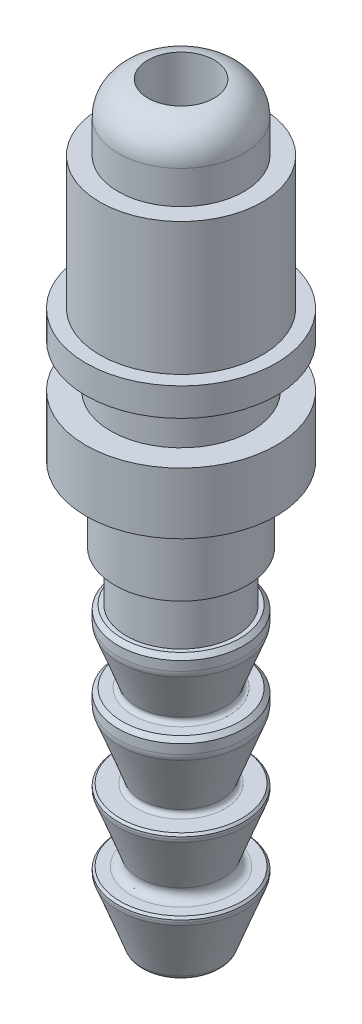
ISO-10303-21;
HEADER;
FILE_DESCRIPTION(('STEP AP214'),'2;1');
FILE_NAME('part.step','',(''),(''),'','','');
FILE_SCHEMA(('AUTOMOTIVE_DESIGN { 1 0 10303 214 1 1 1 1 }'));
ENDSEC;
DATA;
#1=APPLICATION_CONTEXT('core data for automotive mechanical design processes');
#2=APPLICATION_PROTOCOL_DEFINITION('international standard','automotive_design',2000,#1);
#3=PRODUCT_CONTEXT('',#1,'mechanical');
#4=PRODUCT('Part','Part','',(#3));
#5=PRODUCT_RELATED_PRODUCT_CATEGORY('part','',(#4));
#6=PRODUCT_DEFINITION_FORMATION('','',#4);
#7=PRODUCT_DEFINITION_CONTEXT('part definition',#1,'design');
#8=PRODUCT_DEFINITION('design','',#6,#7);
#9=PRODUCT_DEFINITION_SHAPE('','',#8);
#10=(LENGTH_UNIT() NAMED_UNIT(*) SI_UNIT(.MILLI.,.METRE.));
#11=(NAMED_UNIT(*) PLANE_ANGLE_UNIT() SI_UNIT($,.RADIAN.));
#12=(NAMED_UNIT(*) SI_UNIT($,.STERADIAN.) SOLID_ANGLE_UNIT());
#13=UNCERTAINTY_MEASURE_WITH_UNIT(LENGTH_MEASURE(1.E-05),#10,'distance_accuracy_value','');
#14=(GEOMETRIC_REPRESENTATION_CONTEXT(3) GLOBAL_UNCERTAINTY_ASSIGNED_CONTEXT((#13)) GLOBAL_UNIT_ASSIGNED_CONTEXT((#10,
#11,#12)) REPRESENTATION_CONTEXT('',''));
#15=CARTESIAN_POINT('',(0.,0.,0.));
#16=DIRECTION('',(0.,0.,1.));
#17=DIRECTION('',(1.,0.,0.));
#18=AXIS2_PLACEMENT_3D('',#15,#16,#17);
#19=CARTESIAN_POINT('',(0.,-12.4999999999999,0.));
#20=DIRECTION('',(0.,1.,0.));
#21=DIRECTION('',(0.,0.,1.));
#22=AXIS2_PLACEMENT_3D('',#19,#20,#21);
#23=CONICAL_SURFACE('',#22,2.3,0.358770670270573);
#24=CARTESIAN_POINT('',(0.,-11.5122191396029,0.));
#25=DIRECTION('',(0.,1.,0.));
#26=DIRECTION('',(0.,0.,1.));
#27=AXIS2_PLACEMENT_3D('',#24,#25,#26);
#28=CIRCLE('',#27,2.67041782264891);
#29=CARTESIAN_POINT('',(0.,-11.5122191396029,2.67041782264892));
#30=VERTEX_POINT('',#29);
#31=EDGE_CURVE('E62',#30,#30,#28,.T.);
#32=ORIENTED_EDGE('',*,*,#31,.T.);
#33=EDGE_LOOP('',(#32));
#34=FACE_BOUND('',#33,.T.);
#35=CARTESIAN_POINT('',(0.,-8.66978885981584,0.));
#36=DIRECTION('',(0.,-1.,0.));
#37=DIRECTION('',(0.,0.,-1.));
#38=AXIS2_PLACEMENT_3D('',#35,#36,#37);
#39=CIRCLE('',#38,3.73632917756904);
#40=CARTESIAN_POINT('',(0.,-8.66978885981584,-3.73632917756906));
#41=VERTEX_POINT('',#40);
#42=EDGE_CURVE('E74',#41,#41,#39,.T.);
#43=ORIENTED_EDGE('',*,*,#42,.T.);
#44=EDGE_LOOP('',(#43));
#45=FACE_BOUND('',#44,.T.);
#46=ADVANCED_FACE('F45',(#34,#45),#23,.T.);
#47=CARTESIAN_POINT('',(0.,16.,0.));
#48=DIRECTION('',(0.,-1.,0.));
#49=DIRECTION('',(0.,0.,-1.));
#50=AXIS2_PLACEMENT_3D('',#47,#48,#49);
#51=CYLINDRICAL_SURFACE('',#50,5.75);
#52=CARTESIAN_POINT('',(0.,3.69999999999999,0.));
#53=DIRECTION('',(0.,1.,0.));
#54=DIRECTION('',(0.,0.,1.));
#55=AXIS2_PLACEMENT_3D('',#52,#53,#54);
#56=CIRCLE('',#55,5.75);
#57=CARTESIAN_POINT('',(0.,3.69999999999999,5.75000000000002));
#58=VERTEX_POINT('',#57);
#59=EDGE_CURVE('E161',#58,#58,#56,.T.);
#60=ORIENTED_EDGE('',*,*,#59,.F.);
#61=EDGE_LOOP('',(#60));
#62=FACE_BOUND('',#61,.T.);
#63=CARTESIAN_POINT('',(0.,0.,0.));
#64=DIRECTION('',(0.,1.,0.));
#65=DIRECTION('',(0.,0.,1.));
#66=AXIS2_PLACEMENT_3D('',#63,#64,#65);
#67=CIRCLE('',#66,5.75);
#68=CARTESIAN_POINT('',(0.,0.,5.75000000000002));
#69=VERTEX_POINT('',#68);
#70=EDGE_CURVE('E131',#69,#69,#67,.T.);
#71=ORIENTED_EDGE('',*,*,#70,.T.);
#72=EDGE_LOOP('',(#71));
#73=FACE_BOUND('',#72,.T.);
#74=ADVANCED_FACE('F204',(#62,#73),#51,.T.);
#75=CARTESIAN_POINT('',(0.,0.,0.));
#76=DIRECTION('',(0.,1.,0.));
#77=DIRECTION('',(0.,0.,1.));
#78=AXIS2_PLACEMENT_3D('',#75,#76,#77);
#79=PLANE('',#78);
#80=CARTESIAN_POINT('',(0.,0.,0.));
#81=DIRECTION('',(0.,-1.,0.));
#82=DIRECTION('',(0.,0.,-1.));
#83=AXIS2_PLACEMENT_3D('',#80,#81,#82);
#84=CIRCLE('',#83,4.);
#85=CARTESIAN_POINT('',(0.,0.,-4.00000000000002));
#86=VERTEX_POINT('',#85);
#87=EDGE_CURVE('E126',#86,#86,#84,.T.);
#88=ORIENTED_EDGE('',*,*,#87,.F.);
#89=EDGE_LOOP('',(#88));
#90=FACE_BOUND('',#89,.T.);
#91=ORIENTED_EDGE('',*,*,#70,.F.);
#92=EDGE_LOOP('',(#91));
#93=FACE_BOUND('',#92,.T.);
#94=ADVANCED_FACE('F210',(#90,#93),#79,.F.);
#95=CARTESIAN_POINT('',(0.,-4.49999999999997,0.));
#96=DIRECTION('',(0.,1.,0.));
#97=DIRECTION('',(0.,0.,1.));
#98=AXIS2_PLACEMENT_3D('',#95,#96,#97);
#99=CYLINDRICAL_SURFACE('',#98,4.);
#100=CARTESIAN_POINT('',(0.,-4.49999999999997,0.));
#101=DIRECTION('',(0.,-1.,0.));
#102=DIRECTION('',(0.,0.,-1.));
#103=AXIS2_PLACEMENT_3D('',#100,#101,#102);
#104=CIRCLE('',#103,4.);
#105=CARTESIAN_POINT('',(0.,-4.49999999999997,-4.00000000000002));
#106=VERTEX_POINT('',#105);
#107=EDGE_CURVE('E138',#106,#106,#104,.T.);
#108=ORIENTED_EDGE('',*,*,#107,.F.);
#109=EDGE_LOOP('',(#108));
#110=FACE_BOUND('',#109,.T.);
#111=ORIENTED_EDGE('',*,*,#87,.T.);
#112=EDGE_LOOP('',(#111));
#113=FACE_BOUND('',#112,.T.);
#114=ADVANCED_FACE('F233',(#110,#113),#99,.T.);
#115=CARTESIAN_POINT('',(0.,-4.49999999999997,0.));
#116=DIRECTION('',(0.,-1.,0.));
#117=DIRECTION('',(0.,0.,-1.));
#118=AXIS2_PLACEMENT_3D('',#115,#116,#117);
#119=PLANE('',#118);
#120=CARTESIAN_POINT('',(0.,-4.49999999999997,0.));
#121=DIRECTION('',(0.,-1.,0.));
#122=DIRECTION('',(0.,0.,-1.));
#123=AXIS2_PLACEMENT_3D('',#120,#121,#122);
#124=CIRCLE('',#123,3.3);
#125=CARTESIAN_POINT('',(0.,-4.49999999999997,-3.30000000000002));
#126=VERTEX_POINT('',#125);
#127=EDGE_CURVE('E122',#126,#126,#124,.T.);
#128=ORIENTED_EDGE('',*,*,#127,.F.);
#129=EDGE_LOOP('',(#128));
#130=FACE_BOUND('',#129,.T.);
#131=ORIENTED_EDGE('',*,*,#107,.T.);
#132=EDGE_LOOP('',(#131));
#133=FACE_BOUND('',#132,.T.);
#134=ADVANCED_FACE('F229',(#130,#133),#119,.T.);
#135=CARTESIAN_POINT('',(0.,-7.49999999999997,0.));
#136=DIRECTION('',(0.,1.,0.));
#137=DIRECTION('',(0.,0.,1.));
#138=AXIS2_PLACEMENT_3D('',#135,#136,#137);
#139=CYLINDRICAL_SURFACE('',#138,3.3);
#140=CARTESIAN_POINT('',(0.,-7.49999999999997,0.));
#141=DIRECTION('',(0.,-1.,0.));
#142=DIRECTION('',(0.,0.,-1.));
#143=AXIS2_PLACEMENT_3D('',#140,#141,#142);
#144=CIRCLE('',#143,3.3);
#145=CARTESIAN_POINT('',(0.,-7.49999999999997,-3.30000000000002));
#146=VERTEX_POINT('',#145);
#147=EDGE_CURVE('E147',#146,#146,#144,.T.);
#148=ORIENTED_EDGE('',*,*,#147,.F.);
#149=EDGE_LOOP('',(#148));
#150=FACE_BOUND('',#149,.T.);
#151=ORIENTED_EDGE('',*,*,#127,.T.);
#152=EDGE_LOOP('',(#151));
#153=FACE_BOUND('',#152,.T.);
#154=ADVANCED_FACE('F225',(#150,#153),#139,.T.);
#155=CARTESIAN_POINT('',(0.,-8.49999999999997,0.));
#156=DIRECTION('',(0.,1.,0.));
#157=DIRECTION('',(0.,0.,1.));
#158=AXIS2_PLACEMENT_3D('',#155,#156,#157);
#159=CYLINDRICAL_SURFACE('',#158,3.8);
#160=CARTESIAN_POINT('',(0.,-8.31866541822745,0.));
#161=DIRECTION('',(0.,-1.,0.));
#162=DIRECTION('',(0.,0.,-1.));
#163=AXIS2_PLACEMENT_3D('',#160,#161,#162);
#164=CIRCLE('',#163,3.8);
#165=CARTESIAN_POINT('',(0.,-8.31866541822745,-3.80000000000002));
#166=VERTEX_POINT('',#165);
#167=EDGE_CURVE('E77',#166,#166,#164,.F.);
#168=ORIENTED_EDGE('',*,*,#167,.T.);
#169=EDGE_LOOP('',(#168));
#170=FACE_BOUND('',#169,.T.);
#171=CARTESIAN_POINT('',(0.,-7.74999999999994,0.));
#172=DIRECTION('',(0.,-1.,0.));
#173=DIRECTION('',(0.,0.,-1.));
#174=AXIS2_PLACEMENT_3D('',#171,#172,#173);
#175=CIRCLE('',#174,3.8);
#176=CARTESIAN_POINT('',(0.,-7.74999999999994,-3.80000000000002));
#177=VERTEX_POINT('',#176);
#178=EDGE_CURVE('E119',#177,#177,#175,.T.);
#179=ORIENTED_EDGE('',*,*,#178,.T.);
#180=EDGE_LOOP('',(#179));
#181=FACE_BOUND('',#180,.T.);
#182=ADVANCED_FACE('F221',(#170,#181),#159,.T.);
#183=CARTESIAN_POINT('',(0.,-7.49999999999997,0.));
#184=DIRECTION('',(0.,-1.,0.));
#185=DIRECTION('',(0.,0.,-1.));
#186=AXIS2_PLACEMENT_3D('',#183,#184,#185);
#187=PLANE('',#186);
#188=CARTESIAN_POINT('',(0.,-7.49999999999997,0.));
#189=DIRECTION('',(0.,-1.,0.));
#190=DIRECTION('',(0.,0.,-1.));
#191=AXIS2_PLACEMENT_3D('',#188,#189,#190);
#192=CIRCLE('',#191,3.55);
#193=CARTESIAN_POINT('',(0.,-7.49999999999997,-3.55000000000002));
#194=VERTEX_POINT('',#193);
#195=EDGE_CURVE('E116',#194,#194,#192,.F.);
#196=ORIENTED_EDGE('',*,*,#195,.T.);
#197=EDGE_LOOP('',(#196));
#198=FACE_BOUND('',#197,.T.);
#199=ORIENTED_EDGE('',*,*,#147,.T.);
#200=EDGE_LOOP('',(#199));
#201=FACE_BOUND('',#200,.T.);
#202=ADVANCED_FACE('F218',(#198,#201),#187,.F.);
#203=CARTESIAN_POINT('',(0.,-12.85,0.));
#204=DIRECTION('',(0.,1.,0.));
#205=DIRECTION('',(0.,0.,1.));
#206=AXIS2_PLACEMENT_3D('',#203,#204,#205);
#207=CYLINDRICAL_SURFACE('',#206,3.8);
#208=CARTESIAN_POINT('',(0.,-12.6686654182274,0.));
#209=DIRECTION('',(0.,-1.,0.));
#210=DIRECTION('',(0.,0.,-1.));
#211=AXIS2_PLACEMENT_3D('',#208,#209,#210);
#212=CIRCLE('',#211,3.8);
#213=CARTESIAN_POINT('',(0.,-12.6686654182274,-3.80000000000002));
#214=VERTEX_POINT('',#213);
#215=EDGE_CURVE('E83',#214,#214,#212,.F.);
#216=ORIENTED_EDGE('',*,*,#215,.T.);
#217=EDGE_LOOP('',(#216));
#218=FACE_BOUND('',#217,.T.);
#219=CARTESIAN_POINT('',(0.,-12.1,0.));
#220=DIRECTION('',(0.,-1.,0.));
#221=DIRECTION('',(0.,0.,-1.));
#222=AXIS2_PLACEMENT_3D('',#219,#220,#221);
#223=CIRCLE('',#222,3.8);
#224=CARTESIAN_POINT('',(0.,-12.1,-3.80000000000002));
#225=VERTEX_POINT('',#224);
#226=EDGE_CURVE('E113',#225,#225,#223,.T.);
#227=ORIENTED_EDGE('',*,*,#226,.T.);
#228=EDGE_LOOP('',(#227));
#229=FACE_BOUND('',#228,.T.);
#230=ADVANCED_FACE('F216',(#218,#229),#207,.T.);
#231=CARTESIAN_POINT('',(0.,-11.85,0.));
#232=DIRECTION('',(0.,-1.,0.));
#233=DIRECTION('',(0.,0.,-1.));
#234=AXIS2_PLACEMENT_3D('',#231,#232,#233);
#235=PLANE('',#234);
#236=CARTESIAN_POINT('',(0.,-11.85,0.));
#237=DIRECTION('',(0.,-1.,0.));
#238=DIRECTION('',(0.,0.,-1.));
#239=AXIS2_PLACEMENT_3D('',#236,#237,#238);
#240=CIRCLE('',#239,2.90450011704117);
#241=CARTESIAN_POINT('',(0.,-11.85,-2.90450011704118));
#242=VERTEX_POINT('',#241);
#243=EDGE_CURVE('E65',#242,#242,#240,.T.);
#244=ORIENTED_EDGE('',*,*,#243,.T.);
#245=EDGE_LOOP('',(#244));
#246=FACE_BOUND('',#245,.T.);
#247=CARTESIAN_POINT('',(0.,-11.85,0.));
#248=DIRECTION('',(0.,-1.,0.));
#249=DIRECTION('',(0.,0.,-1.));
#250=AXIS2_PLACEMENT_3D('',#247,#248,#249);
#251=CIRCLE('',#250,3.55);
#252=CARTESIAN_POINT('',(0.,-11.85,-3.55000000000002));
#253=VERTEX_POINT('',#252);
#254=EDGE_CURVE('E110',#253,#253,#251,.F.);
#255=ORIENTED_EDGE('',*,*,#254,.T.);
#256=EDGE_LOOP('',(#255));
#257=FACE_BOUND('',#256,.T.);
#258=ADVANCED_FACE('F324',(#246,#257),#235,.F.);
#259=CARTESIAN_POINT('',(-3.8,-16.85,0.));
#260=DIRECTION('',(0.,-1.,0.));
#261=DIRECTION('',(0.,0.,-1.));
#262=AXIS2_PLACEMENT_3D('',#259,#260,#261);
#263=PLANE('',#262);
#264=CARTESIAN_POINT('',(0.,-16.85,0.));
#265=DIRECTION('',(0.,-1.,0.));
#266=DIRECTION('',(0.,0.,-1.));
#267=AXIS2_PLACEMENT_3D('',#264,#265,#266);
#268=CIRCLE('',#267,2.66075011704117);
#269=CARTESIAN_POINT('',(0.,-16.85,-2.66075011704118));
#270=VERTEX_POINT('',#269);
#271=EDGE_CURVE('E68',#270,#270,#268,.T.);
#272=ORIENTED_EDGE('',*,*,#271,.T.);
#273=EDGE_LOOP('',(#272));
#274=FACE_BOUND('',#273,.T.);
#275=CARTESIAN_POINT('',(0.,-16.85,0.));
#276=DIRECTION('',(0.,-1.,0.));
#277=DIRECTION('',(0.,0.,-1.));
#278=AXIS2_PLACEMENT_3D('',#275,#276,#277);
#279=CIRCLE('',#278,3.675);
#280=CARTESIAN_POINT('',(0.,-16.85,-3.67500000000002));
#281=VERTEX_POINT('',#280);
#282=EDGE_CURVE('E107',#281,#281,#279,.F.);
#283=ORIENTED_EDGE('',*,*,#282,.T.);
#284=EDGE_LOOP('',(#283));
#285=FACE_BOUND('',#284,.T.);
#286=ADVANCED_FACE('F322',(#274,#285),#263,.F.);
#287=CARTESIAN_POINT('',(0.,-16.85,0.));
#288=DIRECTION('',(0.,1.,0.));
#289=DIRECTION('',(0.,0.,1.));
#290=AXIS2_PLACEMENT_3D('',#287,#288,#289);
#291=CONICAL_SURFACE('',#290,2.3,0.358770670270573);
#292=CARTESIAN_POINT('',(0.,-16.5122191396029,0.));
#293=DIRECTION('',(0.,1.,0.));
#294=DIRECTION('',(0.,0.,1.));
#295=AXIS2_PLACEMENT_3D('',#292,#293,#294);
#296=CIRCLE('',#295,2.42666782264891);
#297=CARTESIAN_POINT('',(0.,-16.5122191396029,2.42666782264892));
#298=VERTEX_POINT('',#297);
#299=EDGE_CURVE('E71',#298,#298,#296,.T.);
#300=ORIENTED_EDGE('',*,*,#299,.T.);
#301=EDGE_LOOP('',(#300));
#302=FACE_BOUND('',#301,.T.);
#303=CARTESIAN_POINT('',(0.,-13.0197888598158,0.));
#304=DIRECTION('',(0.,-1.,0.));
#305=DIRECTION('',(0.,0.,-1.));
#306=AXIS2_PLACEMENT_3D('',#303,#304,#305);
#307=CIRCLE('',#306,3.73632917756904);
#308=CARTESIAN_POINT('',(0.,-13.0197888598158,-3.73632917756906));
#309=VERTEX_POINT('',#308);
#310=EDGE_CURVE('E80',#309,#309,#307,.T.);
#311=ORIENTED_EDGE('',*,*,#310,.T.);
#312=EDGE_LOOP('',(#311));
#313=FACE_BOUND('',#312,.T.);
#314=ADVANCED_FACE('F317',(#302,#313),#291,.T.);
#315=CARTESIAN_POINT('',(0.,-17.1093327091137,0.));
#316=DIRECTION('',(0.,-1.,0.));
#317=DIRECTION('',(0.,0.,-1.));
#318=AXIS2_PLACEMENT_3D('',#315,#316,#317);
#319=CIRCLE('',#318,3.8);
#320=CARTESIAN_POINT('',(0.,-17.1093327091137,-3.80000000000002));
#321=VERTEX_POINT('',#320);
#322=EDGE_CURVE('E95',#321,#321,#319,.F.);
#323=ORIENTED_EDGE('',*,*,#322,.T.);
#324=EDGE_LOOP('',(#323));
#325=FACE_BOUND('',#324,.T.);
#326=CARTESIAN_POINT('',(0.,-16.975,0.));
#327=DIRECTION('',(0.,-1.,0.));
#328=DIRECTION('',(0.,0.,-1.));
#329=AXIS2_PLACEMENT_3D('',#326,#327,#328);
#330=CIRCLE('',#329,3.8);
#331=CARTESIAN_POINT('',(0.,-16.975,-3.80000000000002));
#332=VERTEX_POINT('',#331);
#333=EDGE_CURVE('E104',#332,#332,#330,.T.);
#334=ORIENTED_EDGE('',*,*,#333,.T.);
#335=EDGE_LOOP('',(#334));
#336=FACE_BOUND('',#335,.T.);
#337=ADVANCED_FACE('F314',(#325,#336),#207,.T.);
#338=CARTESIAN_POINT('',(-3.8,-21.2,0.));
#339=DIRECTION('',(0.,-1.,0.));
#340=DIRECTION('',(0.,0.,-1.));
#341=AXIS2_PLACEMENT_3D('',#338,#339,#340);
#342=PLANE('',#341);
#343=CARTESIAN_POINT('',(0.,-21.2,0.));
#344=DIRECTION('',(0.,-1.,0.));
#345=DIRECTION('',(0.,0.,-1.));
#346=AXIS2_PLACEMENT_3D('',#343,#344,#345);
#347=CIRCLE('',#346,3.02150023408234);
#348=CARTESIAN_POINT('',(0.,-21.2,-3.02150023408236));
#349=VERTEX_POINT('',#348);
#350=EDGE_CURVE('E53',#349,#349,#347,.T.);
#351=ORIENTED_EDGE('',*,*,#350,.T.);
#352=EDGE_LOOP('',(#351));
#353=FACE_BOUND('',#352,.T.);
#354=CARTESIAN_POINT('',(0.,-21.2,0.));
#355=DIRECTION('',(0.,-1.,0.));
#356=DIRECTION('',(0.,0.,-1.));
#357=AXIS2_PLACEMENT_3D('',#354,#355,#356);
#358=CIRCLE('',#357,3.67499999999999);
#359=CARTESIAN_POINT('',(0.,-21.2,-3.67500000000001));
#360=VERTEX_POINT('',#359);
#361=EDGE_CURVE('E101',#360,#360,#358,.F.);
#362=ORIENTED_EDGE('',*,*,#361,.T.);
#363=EDGE_LOOP('',(#362));
#364=FACE_BOUND('',#363,.T.);
#365=ADVANCED_FACE('F308',(#353,#364),#342,.F.);
#366=CARTESIAN_POINT('',(0.,-21.2,0.));
#367=DIRECTION('',(0.,1.,0.));
#368=DIRECTION('',(0.,0.,1.));
#369=AXIS2_PLACEMENT_3D('',#366,#367,#368);
#370=CONICAL_SURFACE('',#369,2.3,0.358770670270573);
#371=CARTESIAN_POINT('',(0.,-20.5244382792058,0.));
#372=DIRECTION('',(0.,1.,0.));
#373=DIRECTION('',(0.,0.,1.));
#374=AXIS2_PLACEMENT_3D('',#371,#372,#373);
#375=CIRCLE('',#374,2.55333564529782);
#376=CARTESIAN_POINT('',(0.,-20.5244382792058,2.55333564529783));
#377=VERTEX_POINT('',#376);
#378=EDGE_CURVE('E57',#377,#377,#375,.T.);
#379=ORIENTED_EDGE('',*,*,#378,.T.);
#380=EDGE_LOOP('',(#379));
#381=FACE_BOUND('',#380,.T.);
#382=CARTESIAN_POINT('',(0.,-17.2848944299079,0.));
#383=DIRECTION('',(0.,-1.,0.));
#384=DIRECTION('',(0.,0.,-1.));
#385=AXIS2_PLACEMENT_3D('',#382,#383,#384);
#386=CIRCLE('',#385,3.76816458878452);
#387=CARTESIAN_POINT('',(0.,-17.2848944299079,-3.76816458878454));
#388=VERTEX_POINT('',#387);
#389=EDGE_CURVE('E92',#388,#388,#386,.T.);
#390=ORIENTED_EDGE('',*,*,#389,.T.);
#391=EDGE_LOOP('',(#390));
#392=FACE_BOUND('',#391,.T.);
#393=ADVANCED_FACE('F304',(#381,#392),#370,.T.);
#394=CARTESIAN_POINT('',(0.,-21.4593327091137,0.));
#395=DIRECTION('',(0.,-1.,0.));
#396=DIRECTION('',(0.,0.,-1.));
#397=AXIS2_PLACEMENT_3D('',#394,#395,#396);
#398=CIRCLE('',#397,3.8);
#399=CARTESIAN_POINT('',(0.,-21.4593327091137,-3.80000000000002));
#400=VERTEX_POINT('',#399);
#401=EDGE_CURVE('E89',#400,#400,#398,.F.);
#402=ORIENTED_EDGE('',*,*,#401,.T.);
#403=EDGE_LOOP('',(#402));
#404=FACE_BOUND('',#403,.T.);
#405=CARTESIAN_POINT('',(0.,-21.325,0.));
#406=DIRECTION('',(0.,-1.,0.));
#407=DIRECTION('',(0.,0.,-1.));
#408=AXIS2_PLACEMENT_3D('',#405,#406,#407);
#409=CIRCLE('',#408,3.8);
#410=CARTESIAN_POINT('',(0.,-21.325,-3.80000000000002));
#411=VERTEX_POINT('',#410);
#412=EDGE_CURVE('E98',#411,#411,#409,.T.);
#413=ORIENTED_EDGE('',*,*,#412,.T.);
#414=EDGE_LOOP('',(#413));
#415=FACE_BOUND('',#414,.T.);
#416=ADVANCED_FACE('F307',(#404,#415),#207,.T.);
#417=CARTESIAN_POINT('',(0.,-25.55,0.));
#418=DIRECTION('',(0.,1.,0.));
#419=DIRECTION('',(0.,0.,1.));
#420=AXIS2_PLACEMENT_3D('',#417,#418,#419);
#421=CONICAL_SURFACE('',#420,2.3,0.358770670270573);
#422=CARTESIAN_POINT('',(0.,-25.2255617207941,0.));
#423=DIRECTION('',(0.,1.,0.));
#424=DIRECTION('',(0.,0.,1.));
#425=AXIS2_PLACEMENT_3D('',#422,#423,#424);
#426=CIRCLE('',#425,2.42166435470217);
#427=CARTESIAN_POINT('',(0.,-25.2255617207941,2.42166435470219));
#428=VERTEX_POINT('',#427);
#429=EDGE_CURVE('E13',#428,#428,#426,.T.);
#430=ORIENTED_EDGE('',*,*,#429,.T.);
#431=EDGE_LOOP('',(#430));
#432=FACE_BOUND('',#431,.T.);
#433=CARTESIAN_POINT('',(0.,-21.6348944299079,0.));
#434=DIRECTION('',(0.,-1.,0.));
#435=DIRECTION('',(0.,0.,-1.));
#436=AXIS2_PLACEMENT_3D('',#433,#434,#435);
#437=CIRCLE('',#436,3.76816458878452);
#438=CARTESIAN_POINT('',(0.,-21.6348944299079,-3.76816458878454));
#439=VERTEX_POINT('',#438);
#440=EDGE_CURVE('E86',#439,#439,#437,.T.);
#441=ORIENTED_EDGE('',*,*,#440,.T.);
#442=EDGE_LOOP('',(#441));
#443=FACE_BOUND('',#442,.T.);
#444=ADVANCED_FACE('F256',(#432,#443),#421,.T.);
#445=CARTESIAN_POINT('',(0.,-7.74999999999994,0.));
#446=DIRECTION('',(0.,-1.,0.));
#447=DIRECTION('',(0.,0.,-1.));
#448=AXIS2_PLACEMENT_3D('',#445,#446,#447);
#449=CONICAL_SURFACE('',#448,3.8,0.785398163397448);
#450=ORIENTED_EDGE('',*,*,#195,.F.);
#451=EDGE_LOOP('',(#450));
#452=FACE_BOUND('',#451,.T.);
#453=ORIENTED_EDGE('',*,*,#178,.F.);
#454=EDGE_LOOP('',(#453));
#455=FACE_BOUND('',#454,.T.);
#456=ADVANCED_FACE('F252',(#452,#455),#449,.T.);
#457=CARTESIAN_POINT('',(0.,-12.1,0.));
#458=DIRECTION('',(0.,-1.,0.));
#459=DIRECTION('',(0.,0.,-1.));
#460=AXIS2_PLACEMENT_3D('',#457,#458,#459);
#461=CONICAL_SURFACE('',#460,3.8,0.785398163397453);
#462=ORIENTED_EDGE('',*,*,#254,.F.);
#463=EDGE_LOOP('',(#462));
#464=FACE_BOUND('',#463,.T.);
#465=ORIENTED_EDGE('',*,*,#226,.F.);
#466=EDGE_LOOP('',(#465));
#467=FACE_BOUND('',#466,.T.);
#468=ADVANCED_FACE('F255',(#464,#467),#461,.T.);
#469=CARTESIAN_POINT('',(0.,-16.85,0.));
#470=DIRECTION('',(0.,-1.,0.));
#471=DIRECTION('',(0.,0.,-1.));
#472=AXIS2_PLACEMENT_3D('',#469,#470,#471);
#473=CONICAL_SURFACE('',#472,3.675,0.785398163397415);
#474=ORIENTED_EDGE('',*,*,#333,.F.);
#475=EDGE_LOOP('',(#474));
#476=FACE_BOUND('',#475,.T.);
#477=ORIENTED_EDGE('',*,*,#282,.F.);
#478=EDGE_LOOP('',(#477));
#479=FACE_BOUND('',#478,.T.);
#480=ADVANCED_FACE('F260',(#476,#479),#473,.T.);
#481=CARTESIAN_POINT('',(0.,-21.2,0.));
#482=DIRECTION('',(0.,-1.,0.));
#483=DIRECTION('',(0.,0.,-1.));
#484=AXIS2_PLACEMENT_3D('',#481,#482,#483);
#485=CONICAL_SURFACE('',#484,3.67499999999999,0.785398163397415);
#486=ORIENTED_EDGE('',*,*,#412,.F.);
#487=EDGE_LOOP('',(#486));
#488=FACE_BOUND('',#487,.T.);
#489=ORIENTED_EDGE('',*,*,#361,.F.);
#490=EDGE_LOOP('',(#489));
#491=FACE_BOUND('',#490,.T.);
#492=ADVANCED_FACE('F264',(#488,#491),#485,.T.);
#493=CARTESIAN_POINT('',(0.,-17.1093327091137,0.));
#494=DIRECTION('',(0.,-1.,0.));
#495=DIRECTION('',(0.,0.,-1.));
#496=AXIS2_PLACEMENT_3D('',#493,#494,#495);
#497=TOROIDAL_SURFACE('',#496,3.3,0.5);
#498=ORIENTED_EDGE('',*,*,#389,.F.);
#499=EDGE_LOOP('',(#498));
#500=FACE_BOUND('',#499,.T.);
#501=ORIENTED_EDGE('',*,*,#322,.F.);
#502=EDGE_LOOP('',(#501));
#503=FACE_BOUND('',#502,.T.);
#504=ADVANCED_FACE('F268',(#500,#503),#497,.T.);
#505=CARTESIAN_POINT('',(0.,-21.4593327091137,0.));
#506=DIRECTION('',(0.,-1.,0.));
#507=DIRECTION('',(0.,0.,-1.));
#508=AXIS2_PLACEMENT_3D('',#505,#506,#507);
#509=TOROIDAL_SURFACE('',#508,3.3,0.5);
#510=ORIENTED_EDGE('',*,*,#440,.F.);
#511=EDGE_LOOP('',(#510));
#512=FACE_BOUND('',#511,.T.);
#513=ORIENTED_EDGE('',*,*,#401,.F.);
#514=EDGE_LOOP('',(#513));
#515=FACE_BOUND('',#514,.T.);
#516=ADVANCED_FACE('F272',(#512,#515),#509,.T.);
#517=CARTESIAN_POINT('',(0.,-12.6686654182274,0.));
#518=DIRECTION('',(0.,-1.,0.));
#519=DIRECTION('',(0.,0.,-1.));
#520=AXIS2_PLACEMENT_3D('',#517,#518,#519);
#521=TOROIDAL_SURFACE('',#520,2.8,1.);
#522=ORIENTED_EDGE('',*,*,#310,.F.);
#523=EDGE_LOOP('',(#522));
#524=FACE_BOUND('',#523,.T.);
#525=ORIENTED_EDGE('',*,*,#215,.F.);
#526=EDGE_LOOP('',(#525));
#527=FACE_BOUND('',#526,.T.);
#528=ADVANCED_FACE('F276',(#524,#527),#521,.T.);
#529=CARTESIAN_POINT('',(0.,-8.31866541822745,0.));
#530=DIRECTION('',(0.,-1.,0.));
#531=DIRECTION('',(0.,0.,-1.));
#532=AXIS2_PLACEMENT_3D('',#529,#530,#531);
#533=TOROIDAL_SURFACE('',#532,2.8,1.);
#534=ORIENTED_EDGE('',*,*,#42,.F.);
#535=EDGE_LOOP('',(#534));
#536=FACE_BOUND('',#535,.T.);
#537=ORIENTED_EDGE('',*,*,#167,.F.);
#538=EDGE_LOOP('',(#537));
#539=FACE_BOUND('',#538,.T.);
#540=ADVANCED_FACE('F280',(#536,#539),#533,.T.);
#541=CARTESIAN_POINT('',(0.,-16.6,0.));
#542=DIRECTION('',(0.,-1.,0.));
#543=DIRECTION('',(0.,0.,-1.));
#544=AXIS2_PLACEMENT_3D('',#541,#542,#543);
#545=TOROIDAL_SURFACE('',#544,2.66075011704117,0.25);
#546=ORIENTED_EDGE('',*,*,#271,.F.);
#547=EDGE_LOOP('',(#546));
#548=FACE_BOUND('',#547,.T.);
#549=ORIENTED_EDGE('',*,*,#299,.F.);
#550=EDGE_LOOP('',(#549));
#551=FACE_BOUND('',#550,.T.);
#552=ADVANCED_FACE('F284',(#548,#551),#545,.F.);
#553=CARTESIAN_POINT('',(0.,-11.6,0.));
#554=DIRECTION('',(0.,-1.,0.));
#555=DIRECTION('',(0.,0.,-1.));
#556=AXIS2_PLACEMENT_3D('',#553,#554,#555);
#557=TOROIDAL_SURFACE('',#556,2.90450011704117,0.25);
#558=ORIENTED_EDGE('',*,*,#31,.F.);
#559=EDGE_LOOP('',(#558));
#560=FACE_BOUND('',#559,.T.);
#561=ORIENTED_EDGE('',*,*,#243,.F.);
#562=EDGE_LOOP('',(#561));
#563=FACE_BOUND('',#562,.T.);
#564=ADVANCED_FACE('F288',(#560,#563),#557,.F.);
#565=CARTESIAN_POINT('',(0.,-20.7,0.));
#566=DIRECTION('',(0.,-1.,0.));
#567=DIRECTION('',(0.,0.,-1.));
#568=AXIS2_PLACEMENT_3D('',#565,#566,#567);
#569=TOROIDAL_SURFACE('',#568,3.02150023408234,0.5);
#570=ORIENTED_EDGE('',*,*,#350,.F.);
#571=EDGE_LOOP('',(#570));
#572=FACE_BOUND('',#571,.T.);
#573=ORIENTED_EDGE('',*,*,#378,.F.);
#574=EDGE_LOOP('',(#573));
#575=FACE_BOUND('',#574,.T.);
#576=ADVANCED_FACE('F291',(#572,#575),#569,.F.);
#577=CARTESIAN_POINT('',(0.,-25.05,0.));
#578=DIRECTION('',(0.,-1.,0.));
#579=DIRECTION('',(0.,0.,-1.));
#580=AXIS2_PLACEMENT_3D('',#577,#578,#579);
#581=TOROIDAL_SURFACE('',#580,1.95349976591765,0.5);
#582=CARTESIAN_POINT('',(0.,-25.547833032482,0.));
#583=DIRECTION('',(0.,1.,0.));
#584=DIRECTION('',(0.,0.,1.));
#585=AXIS2_PLACEMENT_3D('',#582,#583,#584);
#586=CIRCLE('',#585,2.);
#587=CARTESIAN_POINT('',(0.,-25.547833032482,-2.));
#588=VERTEX_POINT('',#587);
#589=EDGE_CURVE('E164',#588,#588,#586,.F.);
#590=ORIENTED_EDGE('',*,*,#589,.F.);
#591=EDGE_LOOP('',(#590));
#592=FACE_BOUND('',#591,.T.);
#593=ORIENTED_EDGE('',*,*,#429,.F.);
#594=EDGE_LOOP('',(#593));
#595=FACE_BOUND('',#594,.T.);
#596=ADVANCED_FACE('F47',(#592,#595),#581,.T.);
#597=CARTESIAN_POINT('',(0.,6.3,5.75000000000003));
#598=DIRECTION('',(0.,1.,0.));
#599=DIRECTION('',(0.,0.,1.));
#600=AXIS2_PLACEMENT_3D('',#597,#598,#599);
#601=PLANE('',#600);
#602=CARTESIAN_POINT('',(0.,6.3,0.));
#603=DIRECTION('',(0.,1.,0.));
#604=DIRECTION('',(0.,0.,1.));
#605=AXIS2_PLACEMENT_3D('',#602,#603,#604);
#606=CIRCLE('',#605,5.75);
#607=CARTESIAN_POINT('',(0.,6.3,5.75000000000002));
#608=VERTEX_POINT('',#607);
#609=EDGE_CURVE('E152',#608,#608,#606,.T.);
#610=ORIENTED_EDGE('',*,*,#609,.F.);
#611=EDGE_LOOP('',(#610));
#612=FACE_BOUND('',#611,.T.);
#613=CARTESIAN_POINT('',(0.,6.3,0.));
#614=DIRECTION('',(0.,1.,0.));
#615=DIRECTION('',(0.,0.,1.));
#616=AXIS2_PLACEMENT_3D('',#613,#614,#615);
#617=CIRCLE('',#616,4.25);
#618=CARTESIAN_POINT('',(0.,6.3,4.25000000000002));
#619=VERTEX_POINT('',#618);
#620=EDGE_CURVE('E155',#619,#619,#617,.T.);
#621=ORIENTED_EDGE('',*,*,#620,.T.);
#622=EDGE_LOOP('',(#621));
#623=FACE_BOUND('',#622,.T.);
#624=ADVANCED_FACE('F298',(#612,#623),#601,.F.);
#625=CARTESIAN_POINT('',(0.,7.99999999999999,0.));
#626=DIRECTION('',(0.,1.,0.));
#627=DIRECTION('',(0.,0.,1.));
#628=AXIS2_PLACEMENT_3D('',#625,#626,#627);
#629=CYLINDRICAL_SURFACE('',#628,4.25);
#630=ORIENTED_EDGE('',*,*,#620,.F.);
#631=EDGE_LOOP('',(#630));
#632=FACE_BOUND('',#631,.T.);
#633=CARTESIAN_POINT('',(0.,3.69999999999999,0.));
#634=DIRECTION('',(0.,1.,0.));
#635=DIRECTION('',(0.,0.,1.));
#636=AXIS2_PLACEMENT_3D('',#633,#634,#635);
#637=CIRCLE('',#636,4.25);
#638=CARTESIAN_POINT('',(0.,3.69999999999999,4.25000000000002));
#639=VERTEX_POINT('',#638);
#640=EDGE_CURVE('E158',#639,#639,#637,.T.);
#641=ORIENTED_EDGE('',*,*,#640,.T.);
#642=EDGE_LOOP('',(#641));
#643=FACE_BOUND('',#642,.T.);
#644=ADVANCED_FACE('F342',(#632,#643),#629,.T.);
#645=CARTESIAN_POINT('',(0.,3.70000000000001,4.25000000000001));
#646=DIRECTION('',(0.,-1.,0.));
#647=DIRECTION('',(0.,0.,-1.));
#648=AXIS2_PLACEMENT_3D('',#645,#646,#647);
#649=PLANE('',#648);
#650=ORIENTED_EDGE('',*,*,#640,.F.);
#651=EDGE_LOOP('',(#650));
#652=FACE_BOUND('',#651,.T.);
#653=ORIENTED_EDGE('',*,*,#59,.T.);
#654=EDGE_LOOP('',(#653));
#655=FACE_BOUND('',#654,.T.);
#656=ADVANCED_FACE('F177',(#652,#655),#649,.F.);
#657=CARTESIAN_POINT('',(0.,18.,0.));
#658=DIRECTION('',(0.,1.,0.));
#659=DIRECTION('',(0.,0.,1.));
#660=AXIS2_PLACEMENT_3D('',#657,#658,#659);
#661=DEGENERATE_TOROIDAL_SURFACE('',#660,1.8,2.,.T.);
#662=CARTESIAN_POINT('',(0.,19.9899748742132,0.));
#663=DIRECTION('',(0.,-1.,0.));
#664=DIRECTION('',(0.,0.,-1.));
#665=AXIS2_PLACEMENT_3D('',#662,#663,#664);
#666=CIRCLE('',#665,2.);
#667=CARTESIAN_POINT('',(0.,19.9899748742132,-2.));
#668=VERTEX_POINT('',#667);
#669=EDGE_CURVE('E49',#668,#668,#666,.F.);
#670=ORIENTED_EDGE('',*,*,#669,.F.);
#671=EDGE_LOOP('',(#670));
#672=FACE_BOUND('',#671,.T.);
#673=CARTESIAN_POINT('',(0.,18.,0.));
#674=DIRECTION('',(0.,1.,0.));
#675=DIRECTION('',(0.,0.,1.));
#676=AXIS2_PLACEMENT_3D('',#673,#674,#675);
#677=CIRCLE('',#676,3.8);
#678=CARTESIAN_POINT('',(0.,18.,3.80000000000002));
#679=VERTEX_POINT('',#678);
#680=EDGE_CURVE('E123',#679,#679,#677,.F.);
#681=ORIENTED_EDGE('',*,*,#680,.F.);
#682=EDGE_LOOP('',(#681));
#683=FACE_BOUND('',#682,.T.);
#684=ADVANCED_FACE('F173',(#672,#683),#661,.T.);
#685=CARTESIAN_POINT('',(0.,20.,0.));
#686=DIRECTION('',(0.,-1.,0.));
#687=DIRECTION('',(0.,0.,-1.));
#688=AXIS2_PLACEMENT_3D('',#685,#686,#687);
#689=CYLINDRICAL_SURFACE('',#688,3.8);
#690=ORIENTED_EDGE('',*,*,#680,.T.);
#691=EDGE_LOOP('',(#690));
#692=FACE_BOUND('',#691,.T.);
#693=CARTESIAN_POINT('',(0.,16.,0.));
#694=DIRECTION('',(0.,1.,0.));
#695=DIRECTION('',(0.,0.,1.));
#696=AXIS2_PLACEMENT_3D('',#693,#694,#695);
#697=CIRCLE('',#696,3.8);
#698=CARTESIAN_POINT('',(0.,16.,3.80000000000002));
#699=VERTEX_POINT('',#698);
#700=EDGE_CURVE('E127',#699,#699,#697,.T.);
#701=ORIENTED_EDGE('',*,*,#700,.T.);
#702=EDGE_LOOP('',(#701));
#703=FACE_BOUND('',#702,.T.);
#704=ADVANCED_FACE('F176',(#692,#703),#689,.T.);
#705=CARTESIAN_POINT('',(0.,16.,0.));
#706=DIRECTION('',(0.,1.,0.));
#707=DIRECTION('',(0.,0.,1.));
#708=AXIS2_PLACEMENT_3D('',#705,#706,#707);
#709=PLANE('',#708);
#710=ORIENTED_EDGE('',*,*,#700,.F.);
#711=EDGE_LOOP('',(#710));
#712=FACE_BOUND('',#711,.T.);
#713=CARTESIAN_POINT('',(0.,16.,0.));
#714=DIRECTION('',(0.,1.,0.));
#715=DIRECTION('',(0.,0.,1.));
#716=AXIS2_PLACEMENT_3D('',#713,#714,#715);
#717=CIRCLE('',#716,4.9);
#718=CARTESIAN_POINT('',(0.,16.,4.90000000000003));
#719=VERTEX_POINT('',#718);
#720=EDGE_CURVE('E135',#719,#719,#717,.T.);
#721=ORIENTED_EDGE('',*,*,#720,.T.);
#722=EDGE_LOOP('',(#721));
#723=FACE_BOUND('',#722,.T.);
#724=ADVANCED_FACE('F183',(#712,#723),#709,.T.);
#725=CARTESIAN_POINT('',(0.,7.99999999999999,0.));
#726=DIRECTION('',(0.,1.,0.));
#727=DIRECTION('',(0.,0.,1.));
#728=AXIS2_PLACEMENT_3D('',#725,#726,#727);
#729=CYLINDRICAL_SURFACE('',#728,4.9);
#730=CARTESIAN_POINT('',(0.,7.99999999999999,0.));
#731=DIRECTION('',(0.,1.,0.));
#732=DIRECTION('',(0.,0.,1.));
#733=AXIS2_PLACEMENT_3D('',#730,#731,#732);
#734=CIRCLE('',#733,4.9);
#735=CARTESIAN_POINT('',(0.,7.99999999999999,4.90000000000002));
#736=VERTEX_POINT('',#735);
#737=EDGE_CURVE('E132',#736,#736,#734,.T.);
#738=ORIENTED_EDGE('',*,*,#737,.T.);
#739=EDGE_LOOP('',(#738));
#740=FACE_BOUND('',#739,.T.);
#741=ORIENTED_EDGE('',*,*,#720,.F.);
#742=EDGE_LOOP('',(#741));
#743=FACE_BOUND('',#742,.T.);
#744=ADVANCED_FACE('F189',(#740,#743),#729,.T.);
#745=CARTESIAN_POINT('',(0.,7.99999999999999,0.));
#746=DIRECTION('',(0.,1.,0.));
#747=DIRECTION('',(0.,0.,1.));
#748=AXIS2_PLACEMENT_3D('',#745,#746,#747);
#749=PLANE('',#748);
#750=ORIENTED_EDGE('',*,*,#737,.F.);
#751=EDGE_LOOP('',(#750));
#752=FACE_BOUND('',#751,.T.);
#753=CARTESIAN_POINT('',(0.,7.99999999999999,0.));
#754=DIRECTION('',(0.,1.,0.));
#755=DIRECTION('',(0.,0.,1.));
#756=AXIS2_PLACEMENT_3D('',#753,#754,#755);
#757=CIRCLE('',#756,5.75);
#758=CARTESIAN_POINT('',(0.,7.99999999999999,5.75000000000002));
#759=VERTEX_POINT('',#758);
#760=EDGE_CURVE('E128',#759,#759,#757,.T.);
#761=ORIENTED_EDGE('',*,*,#760,.T.);
#762=EDGE_LOOP('',(#761));
#763=FACE_BOUND('',#762,.T.);
#764=ADVANCED_FACE('F194',(#752,#763),#749,.T.);
#765=ORIENTED_EDGE('',*,*,#609,.T.);
#766=EDGE_LOOP('',(#765));
#767=FACE_BOUND('',#766,.T.);
#768=ORIENTED_EDGE('',*,*,#760,.F.);
#769=EDGE_LOOP('',(#768));
#770=FACE_BOUND('',#769,.T.);
#771=ADVANCED_FACE('F200',(#767,#770),#51,.T.);
#772=CARTESIAN_POINT('',(0.,20.,0.));
#773=DIRECTION('',(0.,-1.,0.));
#774=DIRECTION('',(0.,0.,-1.));
#775=AXIS2_PLACEMENT_3D('',#772,#773,#774);
#776=CYLINDRICAL_SURFACE('',#775,2.);
#777=CARTESIAN_POINT('',(0.,-25.547833032482,-2.));
#778=CARTESIAN_POINT('',(0.,-25.0734808667873,-2.));
#779=CARTESIAN_POINT('',(0.,-24.5991287010925,-2.));
#780=CARTESIAN_POINT('',(0.,-23.6504243697031,-2.));
#781=CARTESIAN_POINT('',(0.,-23.1760722040083,-2.));
#782=CARTESIAN_POINT('',(0.,-22.2273678726188,-2.));
#783=CARTESIAN_POINT('',(0.,-21.7530157069241,-2.));
#784=CARTESIAN_POINT('',(0.,-20.8043113755346,-2.));
#785=CARTESIAN_POINT('',(0.,-20.3299592098399,-2.));
#786=CARTESIAN_POINT('',(0.,-19.3812548784504,-2.));
#787=CARTESIAN_POINT('',(0.,-18.9069027127556,-2.));
#788=CARTESIAN_POINT('',(0.,-17.9581983813662,-2.));
#789=CARTESIAN_POINT('',(0.,-17.4838462156714,-2.));
#790=CARTESIAN_POINT('',(0.,-16.5351418842819,-2.));
#791=CARTESIAN_POINT('',(0.,-16.0607897185872,-2.));
#792=CARTESIAN_POINT('',(0.,-15.1120853871977,-2.));
#793=CARTESIAN_POINT('',(0.,-14.637733221503,-2.));
#794=CARTESIAN_POINT('',(0.,-13.6890288901135,-2.));
#795=CARTESIAN_POINT('',(0.,-13.2146767244187,-2.));
#796=CARTESIAN_POINT('',(0.,-12.2659723930292,-2.));
#797=CARTESIAN_POINT('',(0.,-11.7916202273345,-2.));
#798=CARTESIAN_POINT('',(0.,-10.842915895945,-2.));
#799=CARTESIAN_POINT('',(0.,-10.3685637302503,-2.));
#800=CARTESIAN_POINT('',(0.,-9.41985939886079,-2.));
#801=CARTESIAN_POINT('',(0.,-8.94550723316605,-2.));
#802=CARTESIAN_POINT('',(0.,-7.99680290177656,-2.));
#803=CARTESIAN_POINT('',(0.,-7.52245073608182,-2.));
#804=CARTESIAN_POINT('',(0.,-6.57374640469233,-2.));
#805=CARTESIAN_POINT('',(0.,-6.09939423899759,-2.));
#806=CARTESIAN_POINT('',(0.,-5.15068990760811,-2.));
#807=CARTESIAN_POINT('',(0.,-4.67633774191337,-2.));
#808=CARTESIAN_POINT('',(0.,-3.72763341052388,-2.));
#809=CARTESIAN_POINT('',(0.,-3.25328124482914,-2.));
#810=CARTESIAN_POINT('',(0.,-2.30457691343965,-2.));
#811=CARTESIAN_POINT('',(0.,-1.83022474774491,-2.));
#812=CARTESIAN_POINT('',(0.,-0.881520416355427,-2.));
#813=CARTESIAN_POINT('',(0.,-0.407168250660685,-2.));
#814=CARTESIAN_POINT('',(0.,0.5415360807288,-2.));
#815=CARTESIAN_POINT('',(0.,1.01588824642354,-2.));
#816=CARTESIAN_POINT('',(0.,1.96459257781303,-2.));
#817=CARTESIAN_POINT('',(0.,2.43894474350777,-2.));
#818=CARTESIAN_POINT('',(0.,3.38764907489725,-2.));
#819=CARTESIAN_POINT('',(0.,3.862001240592,-2.));
#820=CARTESIAN_POINT('',(0.,4.81070557198148,-2.));
#821=CARTESIAN_POINT('',(0.,5.28505773767622,-2.));
#822=CARTESIAN_POINT('',(0.,6.23376206906571,-2.));
#823=CARTESIAN_POINT('',(0.,6.70811423476045,-2.));
#824=CARTESIAN_POINT('',(0.,7.65681856614993,-2.));
#825=CARTESIAN_POINT('',(0.,8.13117073184468,-2.));
#826=CARTESIAN_POINT('',(0.,9.07987506323417,-2.));
#827=CARTESIAN_POINT('',(0.,9.55422722892891,-2.));
#828=CARTESIAN_POINT('',(0.,10.5029315603184,-2.));
#829=CARTESIAN_POINT('',(0.,10.9772837260131,-2.));
#830=CARTESIAN_POINT('',(0.,11.9259880574026,-2.));
#831=CARTESIAN_POINT('',(0.,12.4003402230974,-2.));
#832=CARTESIAN_POINT('',(0.,13.3490445544868,-2.));
#833=CARTESIAN_POINT('',(0.,13.8233967201816,-2.));
#834=CARTESIAN_POINT('',(0.,14.7721010515711,-2.));
#835=CARTESIAN_POINT('',(0.,15.2464532172658,-2.));
#836=CARTESIAN_POINT('',(0.,16.1951575486553,-2.));
#837=CARTESIAN_POINT('',(0.,16.66950971435,-2.));
#838=CARTESIAN_POINT('',(0.,17.6182140457395,-2.));
#839=CARTESIAN_POINT('',(0.,18.0925662114343,-2.));
#840=CARTESIAN_POINT('',(0.,19.0412705428238,-2.));
#841=CARTESIAN_POINT('',(0.,19.5156227085185,-2.));
#842=CARTESIAN_POINT('',(0.,19.9899748742132,-2.));
#843=B_SPLINE_CURVE_WITH_KNOTS('',3,(#777,#778,#779,#780,#781,#782,#783,#784,#785,#786,#787,
#788,#789,#790,#791,#792,#793,#794,#795,#796,#797,#798,#799,#800,#801,#802,#803,#804,#805,#806,
#807,#808,#809,#810,#811,#812,#813,#814,#815,#816,#817,#818,#819,#820,#821,#822,#823,#824,#825,
#826,#827,#828,#829,#830,#831,#832,#833,#834,#835,#836,#837,#838,#839,#840,#841,#842),
.UNSPECIFIED.,.F.,.F.,(4,2,2,2,2,2,2,2,2,2,2,2,2,2,2,2,2,2,2,2,2,2,2,2,2,2,2,2,2,2,2,2,4),(0.,
1.42305649708423,2.84611299416845,4.26916949125268,5.69222598833691,7.11528248542113,
8.53833898250536,9.96139547958959,11.3844519766738,12.807508473758,14.2305649708423,
15.6536214679265,17.0766779650107,18.499734462095,19.9227909591792,21.3458474562634,
22.7689039533476,24.1919604504319,25.6150169475161,27.0380734446003,28.4611299416845,
29.8841864387688,31.307242935853,32.7302994329372,34.1533559300215,35.5764124271057,
36.9994689241899,38.4225254212741,39.8455819183584,41.2686384154426,42.6916949125268,
44.114751409611,45.5378079066953),.UNSPECIFIED.);
#844=EDGE_CURVE('BSEAM171',#588,#668,#843,.T.);
#845=ORIENTED_EDGE('',*,*,#589,.T.);
#846=ORIENTED_EDGE('',*,*,#669,.T.);
#847=ORIENTED_EDGE('',*,*,#844,.T.);
#848=ORIENTED_EDGE('',*,*,#844,.F.);
#849=EDGE_LOOP('',(#845,#847,#846,#848));
#850=FACE_BOUND('',#849,.T.);
#851=ADVANCED_FACE('F171',(#850),#776,.F.);
#852=CLOSED_SHELL('',(#46,#74,#94,#114,#134,#154,#182,#202,#230,#258,#286,#314,#337,#365,#393,
#416,#444,#456,#468,#480,#492,#504,#516,#528,#540,#552,#564,#576,#596,#624,#644,#656,#684,#704,
#724,#744,#764,#771,#851));
#853=MANIFOLD_SOLID_BREP('B2',#852);
#854=ADVANCED_BREP_SHAPE_REPRESENTATION('',(#18,#853),#14);
#855=SHAPE_DEFINITION_REPRESENTATION(#9,#854);
ENDSEC;
END-ISO-10303-21;
